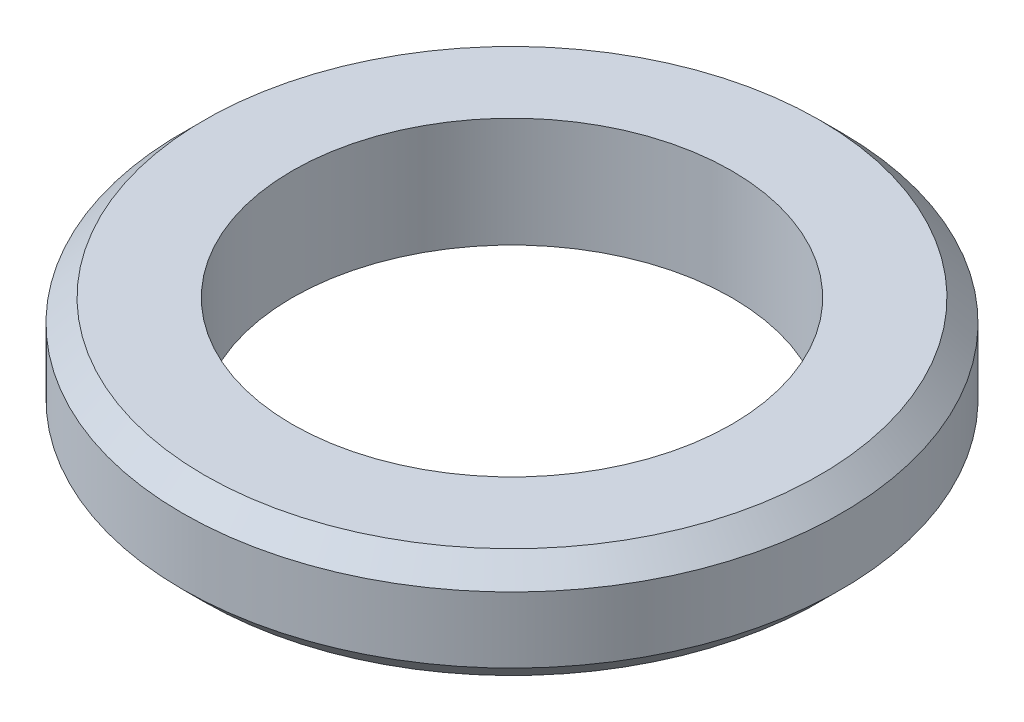
ISO-10303-21;
HEADER;
FILE_DESCRIPTION(('STEP AP214'),'2;1');
FILE_NAME('part.step','',(''),(''),'','','');
FILE_SCHEMA(('AUTOMOTIVE_DESIGN { 1 0 10303 214 1 1 1 1 }'));
ENDSEC;
DATA;
#1=APPLICATION_CONTEXT('core data for automotive mechanical design processes');
#2=APPLICATION_PROTOCOL_DEFINITION('international standard','automotive_design',2000,#1);
#3=PRODUCT_CONTEXT('',#1,'mechanical');
#4=PRODUCT('Part','Part','',(#3));
#5=PRODUCT_RELATED_PRODUCT_CATEGORY('part','',(#4));
#6=PRODUCT_DEFINITION_FORMATION('','',#4);
#7=PRODUCT_DEFINITION_CONTEXT('part definition',#1,'design');
#8=PRODUCT_DEFINITION('design','',#6,#7);
#9=PRODUCT_DEFINITION_SHAPE('','',#8);
#10=(LENGTH_UNIT() NAMED_UNIT(*) SI_UNIT(.MILLI.,.METRE.));
#11=(NAMED_UNIT(*) PLANE_ANGLE_UNIT() SI_UNIT($,.RADIAN.));
#12=(NAMED_UNIT(*) SI_UNIT($,.STERADIAN.) SOLID_ANGLE_UNIT());
#13=UNCERTAINTY_MEASURE_WITH_UNIT(LENGTH_MEASURE(1.E-05),#10,'distance_accuracy_value','');
#14=(GEOMETRIC_REPRESENTATION_CONTEXT(3) GLOBAL_UNCERTAINTY_ASSIGNED_CONTEXT((#13)) GLOBAL_UNIT_ASSIGNED_CONTEXT((#10,
#11,#12)) REPRESENTATION_CONTEXT('',''));
#15=CARTESIAN_POINT('',(0.,0.,0.));
#16=DIRECTION('',(0.,0.,1.));
#17=DIRECTION('',(1.,0.,0.));
#18=AXIS2_PLACEMENT_3D('',#15,#16,#17);
#19=CARTESIAN_POINT('',(0.,2.5,0.));
#20=DIRECTION('',(0.,1.,0.));
#21=DIRECTION('',(0.,0.,1.));
#22=AXIS2_PLACEMENT_3D('',#19,#20,#21);
#23=PLANE('',#22);
#24=CARTESIAN_POINT('',(0.,2.5,0.));
#25=DIRECTION('',(0.,1.,0.));
#26=DIRECTION('',(0.,0.,1.));
#27=AXIS2_PLACEMENT_3D('',#24,#25,#26);
#28=CIRCLE('',#27,7.);
#29=CARTESIAN_POINT('',(0.,2.5,7.));
#30=VERTEX_POINT('',#29);
#31=EDGE_CURVE('E10',#30,#30,#28,.T.);
#32=ORIENTED_EDGE('',*,*,#31,.T.);
#33=EDGE_LOOP('',(#32));
#34=FACE_BOUND('',#33,.T.);
#35=CARTESIAN_POINT('',(0.,2.5,0.));
#36=DIRECTION('',(0.,1.,0.));
#37=DIRECTION('',(0.,0.,1.));
#38=AXIS2_PLACEMENT_3D('',#35,#36,#37);
#39=CIRCLE('',#38,5.);
#40=CARTESIAN_POINT('',(0.,2.5,5.));
#41=VERTEX_POINT('',#40);
#42=EDGE_CURVE('E65',#41,#41,#39,.T.);
#43=ORIENTED_EDGE('',*,*,#42,.F.);
#44=EDGE_LOOP('',(#43));
#45=FACE_BOUND('',#44,.T.);
#46=ADVANCED_FACE('F40',(#34,#45),#23,.T.);
#47=CARTESIAN_POINT('',(0.,0.,0.));
#48=DIRECTION('',(0.,1.,0.));
#49=DIRECTION('',(0.,0.,1.));
#50=AXIS2_PLACEMENT_3D('',#47,#48,#49);
#51=PLANE('',#50);
#52=CARTESIAN_POINT('',(0.,0.,0.));
#53=DIRECTION('',(0.,1.,0.));
#54=DIRECTION('',(0.,0.,1.));
#55=AXIS2_PLACEMENT_3D('',#52,#53,#54);
#56=CIRCLE('',#55,7.);
#57=CARTESIAN_POINT('',(0.,0.,7.));
#58=VERTEX_POINT('',#57);
#59=EDGE_CURVE('E49',#58,#58,#56,.F.);
#60=ORIENTED_EDGE('',*,*,#59,.T.);
#61=EDGE_LOOP('',(#60));
#62=FACE_BOUND('',#61,.T.);
#63=CARTESIAN_POINT('',(0.,0.,0.));
#64=DIRECTION('',(0.,1.,0.));
#65=DIRECTION('',(0.,0.,1.));
#66=AXIS2_PLACEMENT_3D('',#63,#64,#65);
#67=CIRCLE('',#66,5.);
#68=CARTESIAN_POINT('',(0.,0.,5.));
#69=VERTEX_POINT('',#68);
#70=EDGE_CURVE('E66',#69,#69,#67,.T.);
#71=ORIENTED_EDGE('',*,*,#70,.T.);
#72=EDGE_LOOP('',(#71));
#73=FACE_BOUND('',#72,.T.);
#74=ADVANCED_FACE('F78',(#62,#73),#51,.F.);
#75=CARTESIAN_POINT('',(0.,2.5,0.));
#76=DIRECTION('',(0.,-1.,0.));
#77=DIRECTION('',(0.,0.,-1.));
#78=AXIS2_PLACEMENT_3D('',#75,#76,#77);
#79=CYLINDRICAL_SURFACE('',#78,7.5);
#80=CARTESIAN_POINT('',(0.,0.499999999999998,0.));
#81=DIRECTION('',(0.,1.,0.));
#82=DIRECTION('',(0.,0.,1.));
#83=AXIS2_PLACEMENT_3D('',#80,#81,#82);
#84=CIRCLE('',#83,7.5);
#85=CARTESIAN_POINT('',(0.,0.499999999999998,7.5));
#86=VERTEX_POINT('',#85);
#87=EDGE_CURVE('E54',#86,#86,#84,.T.);
#88=ORIENTED_EDGE('',*,*,#87,.T.);
#89=EDGE_LOOP('',(#88));
#90=FACE_BOUND('',#89,.T.);
#91=CARTESIAN_POINT('',(0.,2.,0.));
#92=DIRECTION('',(0.,1.,0.));
#93=DIRECTION('',(0.,0.,1.));
#94=AXIS2_PLACEMENT_3D('',#91,#92,#93);
#95=CIRCLE('',#94,7.5);
#96=CARTESIAN_POINT('',(0.,2.,7.5));
#97=VERTEX_POINT('',#96);
#98=EDGE_CURVE('E59',#97,#97,#95,.F.);
#99=ORIENTED_EDGE('',*,*,#98,.T.);
#100=EDGE_LOOP('',(#99));
#101=FACE_BOUND('',#100,.T.);
#102=ADVANCED_FACE('F83',(#90,#101),#79,.T.);
#103=CARTESIAN_POINT('',(0.,2.5,0.));
#104=DIRECTION('',(0.,-1.,0.));
#105=DIRECTION('',(0.,0.,-1.));
#106=AXIS2_PLACEMENT_3D('',#103,#104,#105);
#107=CYLINDRICAL_SURFACE('',#106,5.);
#108=ORIENTED_EDGE('',*,*,#42,.T.);
#109=EDGE_LOOP('',(#108));
#110=FACE_BOUND('',#109,.T.);
#111=ORIENTED_EDGE('',*,*,#70,.F.);
#112=EDGE_LOOP('',(#111));
#113=FACE_BOUND('',#112,.T.);
#114=ADVANCED_FACE('F74',(#110,#113),#107,.F.);
#115=CARTESIAN_POINT('',(0.,0.499999999999998,0.));
#116=DIRECTION('',(0.,1.,0.));
#117=DIRECTION('',(0.,0.,1.));
#118=AXIS2_PLACEMENT_3D('',#115,#116,#117);
#119=CONICAL_SURFACE('',#118,7.5,0.78539816339745);
#120=ORIENTED_EDGE('',*,*,#59,.F.);
#121=EDGE_LOOP('',(#120));
#122=FACE_BOUND('',#121,.T.);
#123=ORIENTED_EDGE('',*,*,#87,.F.);
#124=EDGE_LOOP('',(#123));
#125=FACE_BOUND('',#124,.T.);
#126=ADVANCED_FACE('F90',(#122,#125),#119,.T.);
#127=CARTESIAN_POINT('',(0.,2.5,0.));
#128=DIRECTION('',(0.,-1.,0.));
#129=DIRECTION('',(0.,0.,-1.));
#130=AXIS2_PLACEMENT_3D('',#127,#128,#129);
#131=CONICAL_SURFACE('',#130,7.,0.785398163397446);
#132=ORIENTED_EDGE('',*,*,#98,.F.);
#133=EDGE_LOOP('',(#132));
#134=FACE_BOUND('',#133,.T.);
#135=ORIENTED_EDGE('',*,*,#31,.F.);
#136=EDGE_LOOP('',(#135));
#137=FACE_BOUND('',#136,.T.);
#138=ADVANCED_FACE('F43',(#134,#137),#131,.T.);
#139=CLOSED_SHELL('',(#46,#74,#102,#114,#126,#138));
#140=MANIFOLD_SOLID_BREP('B2',#139);
#141=ADVANCED_BREP_SHAPE_REPRESENTATION('',(#18,#140),#14);
#142=SHAPE_DEFINITION_REPRESENTATION(#9,#141);
ENDSEC;
END-ISO-10303-21;
